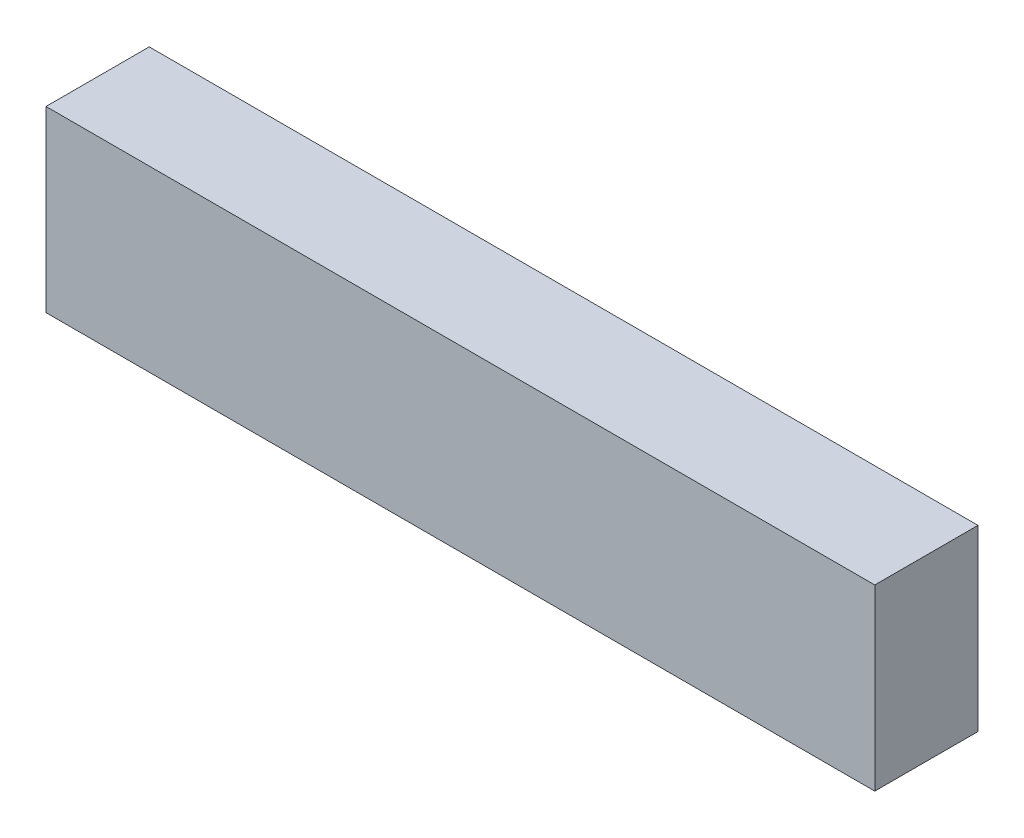
ISO-10303-21;
HEADER;
FILE_DESCRIPTION(('STEP AP214'),'2;1');
FILE_NAME('part.step','',(''),(''),'','','');
FILE_SCHEMA(('AUTOMOTIVE_DESIGN { 1 0 10303 214 1 1 1 1 }'));
ENDSEC;
DATA;
#1=APPLICATION_CONTEXT('core data for automotive mechanical design processes');
#2=APPLICATION_PROTOCOL_DEFINITION('international standard','automotive_design',2000,#1);
#3=PRODUCT_CONTEXT('',#1,'mechanical');
#4=PRODUCT('Part','Part','',(#3));
#5=PRODUCT_RELATED_PRODUCT_CATEGORY('part','',(#4));
#6=PRODUCT_DEFINITION_FORMATION('','',#4);
#7=PRODUCT_DEFINITION_CONTEXT('part definition',#1,'design');
#8=PRODUCT_DEFINITION('design','',#6,#7);
#9=PRODUCT_DEFINITION_SHAPE('','',#8);
#10=(LENGTH_UNIT() NAMED_UNIT(*) SI_UNIT(.MILLI.,.METRE.));
#11=(NAMED_UNIT(*) PLANE_ANGLE_UNIT() SI_UNIT($,.RADIAN.));
#12=(NAMED_UNIT(*) SI_UNIT($,.STERADIAN.) SOLID_ANGLE_UNIT());
#13=UNCERTAINTY_MEASURE_WITH_UNIT(LENGTH_MEASURE(1.E-05),#10,'distance_accuracy_value','');
#14=(GEOMETRIC_REPRESENTATION_CONTEXT(3) GLOBAL_UNCERTAINTY_ASSIGNED_CONTEXT((#13)) GLOBAL_UNIT_ASSIGNED_CONTEXT((#10,
#11,#12)) REPRESENTATION_CONTEXT('',''));
#15=CARTESIAN_POINT('',(0.,0.,0.));
#16=DIRECTION('',(0.,0.,1.));
#17=DIRECTION('',(1.,0.,0.));
#18=AXIS2_PLACEMENT_3D('',#15,#16,#17);
#19=CARTESIAN_POINT('',(7.86450000000038,-17.63,7.25));
#20=DIRECTION('',(1.,0.,0.));
#21=DIRECTION('',(0.,0.,-1.));
#22=AXIS2_PLACEMENT_3D('',#19,#20,#21);
#23=PLANE('',#22);
#24=DIRECTION('',(0.,-1.,0.));
#25=VECTOR('',#24,1.);
#26=CARTESIAN_POINT('',(7.86450000000038,-17.63,0.));
#27=LINE('',#26,#25);
#28=CARTESIAN_POINT('',(7.86450000000038,-17.63,0.));
#29=VERTEX_POINT('',#28);
#30=CARTESIAN_POINT('',(7.86450000000038,-30.17,0.));
#31=VERTEX_POINT('',#30);
#32=EDGE_CURVE('E128',#29,#31,#27,.T.);
#33=ORIENTED_EDGE('',*,*,#32,.T.);
#34=DIRECTION('',(0.,0.,-1.));
#35=VECTOR('',#34,1.);
#36=CARTESIAN_POINT('',(7.86450000000038,-30.17,7.25));
#37=LINE('',#36,#35);
#38=CARTESIAN_POINT('',(7.86450000000038,-30.17,7.25));
#39=VERTEX_POINT('',#38);
#40=EDGE_CURVE('E11',#39,#31,#37,.T.);
#41=ORIENTED_EDGE('',*,*,#40,.F.);
#42=DIRECTION('',(0.,-1.,0.));
#43=VECTOR('',#42,1.);
#44=CARTESIAN_POINT('',(7.86450000000038,-17.63,7.25));
#45=LINE('',#44,#43);
#46=CARTESIAN_POINT('',(7.86450000000038,-17.63,7.25));
#47=VERTEX_POINT('',#46);
#48=EDGE_CURVE('E148',#47,#39,#45,.T.);
#49=ORIENTED_EDGE('',*,*,#48,.F.);
#50=DIRECTION('',(0.,0.,-1.));
#51=VECTOR('',#50,1.);
#52=CARTESIAN_POINT('',(7.86450000000038,-17.63,7.25));
#53=LINE('',#52,#51);
#54=EDGE_CURVE('E153',#47,#29,#53,.T.);
#55=ORIENTED_EDGE('',*,*,#54,.T.);
#56=EDGE_LOOP('',(#33,#41,#49,#55));
#57=FACE_BOUND('',#56,.T.);
#58=ADVANCED_FACE('F32',(#57),#23,.F.);
#59=CARTESIAN_POINT('',(7.86450000000038,-30.17,7.25));
#60=DIRECTION('',(0.,1.,0.));
#61=DIRECTION('',(0.,0.,1.));
#62=AXIS2_PLACEMENT_3D('',#59,#60,#61);
#63=PLANE('',#62);
#64=DIRECTION('',(1.,0.,0.));
#65=VECTOR('',#64,1.);
#66=CARTESIAN_POINT('',(7.86450000000038,-30.17,0.));
#67=LINE('',#66,#65);
#68=CARTESIAN_POINT('',(66.0645000000004,-30.17,0.));
#69=VERTEX_POINT('',#68);
#70=EDGE_CURVE('E132',#31,#69,#67,.T.);
#71=ORIENTED_EDGE('',*,*,#70,.T.);
#72=DIRECTION('',(0.,0.,-1.));
#73=VECTOR('',#72,1.);
#74=CARTESIAN_POINT('',(66.0645000000004,-30.17,7.25));
#75=LINE('',#74,#73);
#76=CARTESIAN_POINT('',(66.0645000000004,-30.17,7.25));
#77=VERTEX_POINT('',#76);
#78=EDGE_CURVE('E39',#77,#69,#75,.T.);
#79=ORIENTED_EDGE('',*,*,#78,.F.);
#80=DIRECTION('',(1.,0.,0.));
#81=VECTOR('',#80,1.);
#82=CARTESIAN_POINT('',(7.86450000000038,-30.17,7.25));
#83=LINE('',#82,#81);
#84=EDGE_CURVE('E83',#39,#77,#83,.T.);
#85=ORIENTED_EDGE('',*,*,#84,.F.);
#86=ORIENTED_EDGE('',*,*,#40,.T.);
#87=EDGE_LOOP('',(#71,#79,#85,#86));
#88=FACE_BOUND('',#87,.T.);
#89=ADVANCED_FACE('F182',(#88),#63,.F.);
#90=CARTESIAN_POINT('',(66.0645000000004,-17.63,7.25));
#91=DIRECTION('',(-1.,0.,0.));
#92=DIRECTION('',(0.,0.,1.));
#93=AXIS2_PLACEMENT_3D('',#90,#91,#92);
#94=PLANE('',#93);
#95=DIRECTION('',(0.,1.,0.));
#96=VECTOR('',#95,1.);
#97=CARTESIAN_POINT('',(66.0645000000004,-17.63,0.));
#98=LINE('',#97,#96);
#99=CARTESIAN_POINT('',(66.0645000000004,-17.63,0.));
#100=VERTEX_POINT('',#99);
#101=EDGE_CURVE('E156',#69,#100,#98,.T.);
#102=ORIENTED_EDGE('',*,*,#101,.T.);
#103=DIRECTION('',(0.,0.,-1.));
#104=VECTOR('',#103,1.);
#105=CARTESIAN_POINT('',(66.0645000000004,-17.63,7.25));
#106=LINE('',#105,#104);
#107=CARTESIAN_POINT('',(66.0645000000004,-17.63,7.25));
#108=VERTEX_POINT('',#107);
#109=EDGE_CURVE('E160',#108,#100,#106,.T.);
#110=ORIENTED_EDGE('',*,*,#109,.F.);
#111=DIRECTION('',(0.,1.,0.));
#112=VECTOR('',#111,1.);
#113=CARTESIAN_POINT('',(66.0645000000004,-17.63,7.25));
#114=LINE('',#113,#112);
#115=EDGE_CURVE('E151',#77,#108,#114,.T.);
#116=ORIENTED_EDGE('',*,*,#115,.F.);
#117=ORIENTED_EDGE('',*,*,#78,.T.);
#118=EDGE_LOOP('',(#102,#110,#116,#117));
#119=FACE_BOUND('',#118,.T.);
#120=ADVANCED_FACE('F165',(#119),#94,.F.);
#121=CARTESIAN_POINT('',(7.86450000000038,-17.63,7.25));
#122=DIRECTION('',(0.,-1.,0.));
#123=DIRECTION('',(0.,0.,-1.));
#124=AXIS2_PLACEMENT_3D('',#121,#122,#123);
#125=PLANE('',#124);
#126=DIRECTION('',(-1.,0.,0.));
#127=VECTOR('',#126,1.);
#128=CARTESIAN_POINT('',(7.86450000000038,-17.63,0.));
#129=LINE('',#128,#127);
#130=EDGE_CURVE('E76',#100,#29,#129,.T.);
#131=ORIENTED_EDGE('',*,*,#130,.T.);
#132=ORIENTED_EDGE('',*,*,#54,.F.);
#133=DIRECTION('',(-1.,0.,0.));
#134=VECTOR('',#133,1.);
#135=CARTESIAN_POINT('',(7.86450000000038,-17.63,7.25));
#136=LINE('',#135,#134);
#137=EDGE_CURVE('E55',#108,#47,#136,.T.);
#138=ORIENTED_EDGE('',*,*,#137,.F.);
#139=ORIENTED_EDGE('',*,*,#109,.T.);
#140=EDGE_LOOP('',(#131,#132,#138,#139));
#141=FACE_BOUND('',#140,.T.);
#142=ADVANCED_FACE('F173',(#141),#125,.F.);
#143=CARTESIAN_POINT('',(0.,0.,7.25));
#144=DIRECTION('',(0.,0.,1.));
#145=DIRECTION('',(1.,0.,0.));
#146=AXIS2_PLACEMENT_3D('',#143,#144,#145);
#147=PLANE('',#146);
#148=ORIENTED_EDGE('',*,*,#48,.T.);
#149=ORIENTED_EDGE('',*,*,#84,.T.);
#150=ORIENTED_EDGE('',*,*,#115,.T.);
#151=ORIENTED_EDGE('',*,*,#137,.T.);
#152=EDGE_LOOP('',(#148,#149,#150,#151));
#153=FACE_BOUND('',#152,.T.);
#154=ADVANCED_FACE('F175',(#153),#147,.T.);
#155=CARTESIAN_POINT('',(0.,0.,0.));
#156=DIRECTION('',(0.,0.,1.));
#157=DIRECTION('',(1.,0.,0.));
#158=AXIS2_PLACEMENT_3D('',#155,#156,#157);
#159=PLANE('',#158);
#160=DIRECTION('',(-1.,0.,0.));
#161=VECTOR('',#160,1.);
#162=CARTESIAN_POINT('',(7.86450000000038,-18.13,0.));
#163=LINE('',#162,#161);
#164=CARTESIAN_POINT('',(65.5645000000004,-18.13,0.));
#165=VERTEX_POINT('',#164);
#166=CARTESIAN_POINT('',(8.36450000000038,-18.13,0.));
#167=VERTEX_POINT('',#166);
#168=EDGE_CURVE('E123',#165,#167,#163,.T.);
#169=ORIENTED_EDGE('',*,*,#168,.T.);
#170=DIRECTION('',(0.,-1.,0.));
#171=VECTOR('',#170,1.);
#172=CARTESIAN_POINT('',(8.36450000000038,-17.63,0.));
#173=LINE('',#172,#171);
#174=CARTESIAN_POINT('',(8.36450000000038,-29.67,0.));
#175=VERTEX_POINT('',#174);
#176=EDGE_CURVE('E142',#167,#175,#173,.T.);
#177=ORIENTED_EDGE('',*,*,#176,.T.);
#178=DIRECTION('',(1.,0.,0.));
#179=VECTOR('',#178,1.);
#180=CARTESIAN_POINT('',(7.86450000000038,-29.67,0.));
#181=LINE('',#180,#179);
#182=CARTESIAN_POINT('',(65.5645000000004,-29.67,0.));
#183=VERTEX_POINT('',#182);
#184=EDGE_CURVE('E127',#175,#183,#181,.T.);
#185=ORIENTED_EDGE('',*,*,#184,.T.);
#186=DIRECTION('',(0.,1.,0.));
#187=VECTOR('',#186,1.);
#188=CARTESIAN_POINT('',(65.5645000000004,-17.63,0.));
#189=LINE('',#188,#187);
#190=EDGE_CURVE('E46',#183,#165,#189,.T.);
#191=ORIENTED_EDGE('',*,*,#190,.T.);
#192=EDGE_LOOP('',(#169,#177,#185,#191));
#193=FACE_BOUND('',#192,.T.);
#194=ORIENTED_EDGE('',*,*,#32,.F.);
#195=ORIENTED_EDGE('',*,*,#130,.F.);
#196=ORIENTED_EDGE('',*,*,#101,.F.);
#197=ORIENTED_EDGE('',*,*,#70,.F.);
#198=EDGE_LOOP('',(#194,#195,#196,#197));
#199=FACE_BOUND('',#198,.T.);
#200=ADVANCED_FACE('F169',(#193,#199),#159,.F.);
#201=CARTESIAN_POINT('',(8.36450000000038,-17.63,7.25));
#202=DIRECTION('',(1.,0.,0.));
#203=DIRECTION('',(0.,0.,-1.));
#204=AXIS2_PLACEMENT_3D('',#201,#202,#203);
#205=PLANE('',#204);
#206=ORIENTED_EDGE('',*,*,#176,.F.);
#207=DIRECTION('',(0.,0.,-1.));
#208=VECTOR('',#207,1.);
#209=CARTESIAN_POINT('',(8.36450000000038,-18.13,7.25));
#210=LINE('',#209,#208);
#211=CARTESIAN_POINT('',(8.36450000000038,-18.13,7.05));
#212=VERTEX_POINT('',#211);
#213=EDGE_CURVE('E122',#212,#167,#210,.T.);
#214=ORIENTED_EDGE('',*,*,#213,.F.);
#215=DIRECTION('',(0.,-1.,0.));
#216=VECTOR('',#215,1.);
#217=CARTESIAN_POINT('',(8.36450000000038,-17.63,7.05));
#218=LINE('',#217,#216);
#219=CARTESIAN_POINT('',(8.36450000000038,-29.67,7.05));
#220=VERTEX_POINT('',#219);
#221=EDGE_CURVE('E110',#212,#220,#218,.T.);
#222=ORIENTED_EDGE('',*,*,#221,.T.);
#223=DIRECTION('',(0.,0.,-1.));
#224=VECTOR('',#223,1.);
#225=CARTESIAN_POINT('',(8.36450000000038,-29.67,7.25));
#226=LINE('',#225,#224);
#227=EDGE_CURVE('E120',#220,#175,#226,.T.);
#228=ORIENTED_EDGE('',*,*,#227,.T.);
#229=EDGE_LOOP('',(#206,#214,#222,#228));
#230=FACE_BOUND('',#229,.T.);
#231=ADVANCED_FACE('F119',(#230),#205,.T.);
#232=CARTESIAN_POINT('',(7.86450000000038,-29.67,7.25));
#233=DIRECTION('',(0.,1.,0.));
#234=DIRECTION('',(0.,0.,1.));
#235=AXIS2_PLACEMENT_3D('',#232,#233,#234);
#236=PLANE('',#235);
#237=ORIENTED_EDGE('',*,*,#184,.F.);
#238=ORIENTED_EDGE('',*,*,#227,.F.);
#239=DIRECTION('',(1.,0.,0.));
#240=VECTOR('',#239,1.);
#241=CARTESIAN_POINT('',(7.86450000000038,-29.67,7.05));
#242=LINE('',#241,#240);
#243=CARTESIAN_POINT('',(65.5645000000004,-29.67,7.05));
#244=VERTEX_POINT('',#243);
#245=EDGE_CURVE('E106',#220,#244,#242,.T.);
#246=ORIENTED_EDGE('',*,*,#245,.T.);
#247=DIRECTION('',(0.,0.,-1.));
#248=VECTOR('',#247,1.);
#249=CARTESIAN_POINT('',(65.5645000000004,-29.67,7.25));
#250=LINE('',#249,#248);
#251=EDGE_CURVE('E129',#244,#183,#250,.T.);
#252=ORIENTED_EDGE('',*,*,#251,.T.);
#253=EDGE_LOOP('',(#237,#238,#246,#252));
#254=FACE_BOUND('',#253,.T.);
#255=ADVANCED_FACE('F125',(#254),#236,.T.);
#256=CARTESIAN_POINT('',(65.5645000000004,-17.63,7.25));
#257=DIRECTION('',(-1.,0.,0.));
#258=DIRECTION('',(0.,0.,1.));
#259=AXIS2_PLACEMENT_3D('',#256,#257,#258);
#260=PLANE('',#259);
#261=ORIENTED_EDGE('',*,*,#190,.F.);
#262=ORIENTED_EDGE('',*,*,#251,.F.);
#263=DIRECTION('',(0.,1.,0.));
#264=VECTOR('',#263,1.);
#265=CARTESIAN_POINT('',(65.5645000000004,-17.63,7.05));
#266=LINE('',#265,#264);
#267=CARTESIAN_POINT('',(65.5645000000004,-18.13,7.05));
#268=VERTEX_POINT('',#267);
#269=EDGE_CURVE('E111',#244,#268,#266,.T.);
#270=ORIENTED_EDGE('',*,*,#269,.T.);
#271=DIRECTION('',(0.,0.,-1.));
#272=VECTOR('',#271,1.);
#273=CARTESIAN_POINT('',(65.5645000000004,-18.13,7.25));
#274=LINE('',#273,#272);
#275=EDGE_CURVE('E134',#268,#165,#274,.T.);
#276=ORIENTED_EDGE('',*,*,#275,.T.);
#277=EDGE_LOOP('',(#261,#262,#270,#276));
#278=FACE_BOUND('',#277,.T.);
#279=ADVANCED_FACE('F230',(#278),#260,.T.);
#280=CARTESIAN_POINT('',(7.86450000000038,-18.13,7.25));
#281=DIRECTION('',(0.,-1.,0.));
#282=DIRECTION('',(0.,0.,-1.));
#283=AXIS2_PLACEMENT_3D('',#280,#281,#282);
#284=PLANE('',#283);
#285=ORIENTED_EDGE('',*,*,#168,.F.);
#286=ORIENTED_EDGE('',*,*,#275,.F.);
#287=DIRECTION('',(-1.,0.,0.));
#288=VECTOR('',#287,1.);
#289=CARTESIAN_POINT('',(7.86450000000038,-18.13,7.05));
#290=LINE('',#289,#288);
#291=EDGE_CURVE('E137',#268,#212,#290,.T.);
#292=ORIENTED_EDGE('',*,*,#291,.T.);
#293=ORIENTED_EDGE('',*,*,#213,.T.);
#294=EDGE_LOOP('',(#285,#286,#292,#293));
#295=FACE_BOUND('',#294,.T.);
#296=ADVANCED_FACE('F239',(#295),#284,.T.);
#297=CARTESIAN_POINT('',(0.,0.,7.05));
#298=DIRECTION('',(0.,0.,1.));
#299=DIRECTION('',(1.,0.,0.));
#300=AXIS2_PLACEMENT_3D('',#297,#298,#299);
#301=PLANE('',#300);
#302=ORIENTED_EDGE('',*,*,#221,.F.);
#303=ORIENTED_EDGE('',*,*,#291,.F.);
#304=ORIENTED_EDGE('',*,*,#269,.F.);
#305=ORIENTED_EDGE('',*,*,#245,.F.);
#306=EDGE_LOOP('',(#302,#303,#304,#305));
#307=FACE_BOUND('',#306,.T.);
#308=ADVANCED_FACE('F108',(#307),#301,.F.);
#309=CLOSED_SHELL('',(#58,#89,#120,#142,#154,#200,#231,#255,#279,#296,#308));
#310=MANIFOLD_SOLID_BREP('B2',#309);
#311=ADVANCED_BREP_SHAPE_REPRESENTATION('',(#18,#310),#14);
#312=SHAPE_DEFINITION_REPRESENTATION(#9,#311);
ENDSEC;
END-ISO-10303-21;
